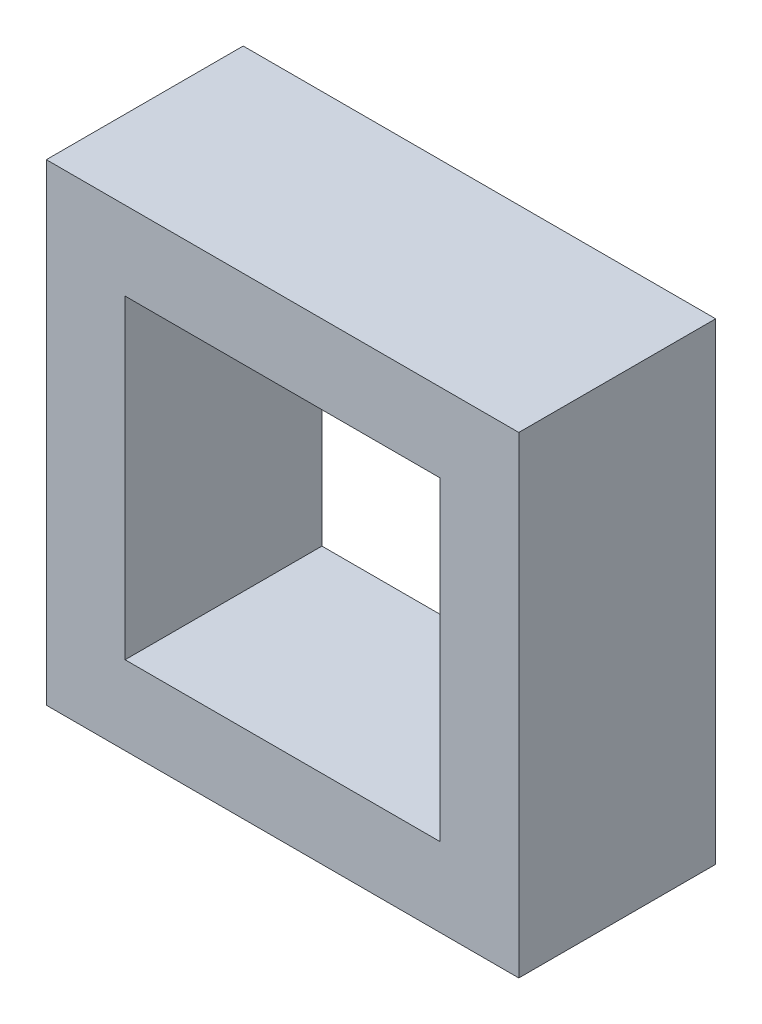
ISO-10303-21;
HEADER;
FILE_DESCRIPTION(('STEP AP214'),'2;1');
FILE_NAME('part.step','',(''),(''),'','','');
FILE_SCHEMA(('AUTOMOTIVE_DESIGN { 1 0 10303 214 1 1 1 1 }'));
ENDSEC;
DATA;
#1=APPLICATION_CONTEXT('core data for automotive mechanical design processes');
#2=APPLICATION_PROTOCOL_DEFINITION('international standard','automotive_design',2000,#1);
#3=PRODUCT_CONTEXT('',#1,'mechanical');
#4=PRODUCT('Part','Part','',(#3));
#5=PRODUCT_RELATED_PRODUCT_CATEGORY('part','',(#4));
#6=PRODUCT_DEFINITION_FORMATION('','',#4);
#7=PRODUCT_DEFINITION_CONTEXT('part definition',#1,'design');
#8=PRODUCT_DEFINITION('design','',#6,#7);
#9=PRODUCT_DEFINITION_SHAPE('','',#8);
#10=(LENGTH_UNIT() NAMED_UNIT(*) SI_UNIT(.MILLI.,.METRE.));
#11=(NAMED_UNIT(*) PLANE_ANGLE_UNIT() SI_UNIT($,.RADIAN.));
#12=(NAMED_UNIT(*) SI_UNIT($,.STERADIAN.) SOLID_ANGLE_UNIT());
#13=UNCERTAINTY_MEASURE_WITH_UNIT(LENGTH_MEASURE(1.E-05),#10,'distance_accuracy_value','');
#14=(GEOMETRIC_REPRESENTATION_CONTEXT(3) GLOBAL_UNCERTAINTY_ASSIGNED_CONTEXT((#13)) GLOBAL_UNIT_ASSIGNED_CONTEXT((#10,
#11,#12)) REPRESENTATION_CONTEXT('',''));
#15=CARTESIAN_POINT('',(0.,0.,0.));
#16=DIRECTION('',(0.,0.,1.));
#17=DIRECTION('',(1.,0.,0.));
#18=AXIS2_PLACEMENT_3D('',#15,#16,#17);
#19=CARTESIAN_POINT('',(0.,0.,5.));
#20=DIRECTION('',(0.,0.,1.));
#21=DIRECTION('',(1.,0.,0.));
#22=AXIS2_PLACEMENT_3D('',#19,#20,#21);
#23=PLANE('',#22);
#24=DIRECTION('',(0.,-1.,0.));
#25=VECTOR('',#24,1.);
#26=CARTESIAN_POINT('',(-12.,12.,5.));
#27=LINE('',#26,#25);
#28=CARTESIAN_POINT('',(-12.,12.,5.));
#29=VERTEX_POINT('',#28);
#30=CARTESIAN_POINT('',(-12.,-12.,5.));
#31=VERTEX_POINT('',#30);
#32=EDGE_CURVE('E134',#29,#31,#27,.T.);
#33=ORIENTED_EDGE('',*,*,#32,.T.);
#34=DIRECTION('',(1.,0.,0.));
#35=VECTOR('',#34,1.);
#36=CARTESIAN_POINT('',(-12.,-12.,5.));
#37=LINE('',#36,#35);
#38=CARTESIAN_POINT('',(12.,-12.,5.));
#39=VERTEX_POINT('',#38);
#40=EDGE_CURVE('E137',#31,#39,#37,.T.);
#41=ORIENTED_EDGE('',*,*,#40,.T.);
#42=DIRECTION('',(0.,1.,0.));
#43=VECTOR('',#42,1.);
#44=CARTESIAN_POINT('',(12.,12.,5.));
#45=LINE('',#44,#43);
#46=CARTESIAN_POINT('',(12.,12.,5.));
#47=VERTEX_POINT('',#46);
#48=EDGE_CURVE('E140',#39,#47,#45,.T.);
#49=ORIENTED_EDGE('',*,*,#48,.T.);
#50=DIRECTION('',(-1.,0.,0.));
#51=VECTOR('',#50,1.);
#52=CARTESIAN_POINT('',(-12.,12.,5.));
#53=LINE('',#52,#51);
#54=EDGE_CURVE('E142',#47,#29,#53,.T.);
#55=ORIENTED_EDGE('',*,*,#54,.T.);
#56=EDGE_LOOP('',(#33,#41,#49,#55));
#57=FACE_BOUND('',#56,.T.);
#58=DIRECTION('',(1.,0.,0.));
#59=VECTOR('',#58,1.);
#60=CARTESIAN_POINT('',(-8.,-8.,5.));
#61=LINE('',#60,#59);
#62=CARTESIAN_POINT('',(-8.,-8.,5.));
#63=VERTEX_POINT('',#62);
#64=CARTESIAN_POINT('',(8.,-8.,5.));
#65=VERTEX_POINT('',#64);
#66=EDGE_CURVE('E106',#63,#65,#61,.T.);
#67=ORIENTED_EDGE('',*,*,#66,.F.);
#68=DIRECTION('',(0.,-1.,0.));
#69=VECTOR('',#68,1.);
#70=CARTESIAN_POINT('',(-8.,8.,5.));
#71=LINE('',#70,#69);
#72=CARTESIAN_POINT('',(-8.,8.,5.));
#73=VERTEX_POINT('',#72);
#74=EDGE_CURVE('E98',#73,#63,#71,.T.);
#75=ORIENTED_EDGE('',*,*,#74,.F.);
#76=DIRECTION('',(-1.,0.,0.));
#77=VECTOR('',#76,1.);
#78=CARTESIAN_POINT('',(-8.,8.,5.));
#79=LINE('',#78,#77);
#80=CARTESIAN_POINT('',(8.,8.,5.));
#81=VERTEX_POINT('',#80);
#82=EDGE_CURVE('E120',#81,#73,#79,.T.);
#83=ORIENTED_EDGE('',*,*,#82,.F.);
#84=DIRECTION('',(0.,1.,0.));
#85=VECTOR('',#84,1.);
#86=CARTESIAN_POINT('',(8.,8.,5.));
#87=LINE('',#86,#85);
#88=EDGE_CURVE('E118',#65,#81,#87,.T.);
#89=ORIENTED_EDGE('',*,*,#88,.F.);
#90=EDGE_LOOP('',(#67,#75,#83,#89));
#91=FACE_BOUND('',#90,.T.);
#92=ADVANCED_FACE('F33',(#57,#91),#23,.T.);
#93=CARTESIAN_POINT('',(0.,0.,-5.));
#94=DIRECTION('',(0.,0.,1.));
#95=DIRECTION('',(1.,0.,0.));
#96=AXIS2_PLACEMENT_3D('',#93,#94,#95);
#97=PLANE('',#96);
#98=DIRECTION('',(0.,-1.,0.));
#99=VECTOR('',#98,1.);
#100=CARTESIAN_POINT('',(-12.,12.,-5.));
#101=LINE('',#100,#99);
#102=CARTESIAN_POINT('',(-12.,12.,-5.));
#103=VERTEX_POINT('',#102);
#104=CARTESIAN_POINT('',(-12.,-12.,-5.));
#105=VERTEX_POINT('',#104);
#106=EDGE_CURVE('E114',#103,#105,#101,.T.);
#107=ORIENTED_EDGE('',*,*,#106,.F.);
#108=DIRECTION('',(-1.,0.,0.));
#109=VECTOR('',#108,1.);
#110=CARTESIAN_POINT('',(-12.,12.,-5.));
#111=LINE('',#110,#109);
#112=CARTESIAN_POINT('',(12.,12.,-5.));
#113=VERTEX_POINT('',#112);
#114=EDGE_CURVE('E138',#113,#103,#111,.T.);
#115=ORIENTED_EDGE('',*,*,#114,.F.);
#116=DIRECTION('',(0.,1.,0.));
#117=VECTOR('',#116,1.);
#118=CARTESIAN_POINT('',(12.,12.,-5.));
#119=LINE('',#118,#117);
#120=CARTESIAN_POINT('',(12.,-12.,-5.));
#121=VERTEX_POINT('',#120);
#122=EDGE_CURVE('E149',#121,#113,#119,.T.);
#123=ORIENTED_EDGE('',*,*,#122,.F.);
#124=DIRECTION('',(1.,0.,0.));
#125=VECTOR('',#124,1.);
#126=CARTESIAN_POINT('',(-12.,-12.,-5.));
#127=LINE('',#126,#125);
#128=EDGE_CURVE('E147',#105,#121,#127,.T.);
#129=ORIENTED_EDGE('',*,*,#128,.F.);
#130=EDGE_LOOP('',(#107,#115,#123,#129));
#131=FACE_BOUND('',#130,.T.);
#132=DIRECTION('',(0.,-1.,0.));
#133=VECTOR('',#132,1.);
#134=CARTESIAN_POINT('',(-8.,8.,-5.));
#135=LINE('',#134,#133);
#136=CARTESIAN_POINT('',(-8.,8.,-5.));
#137=VERTEX_POINT('',#136);
#138=CARTESIAN_POINT('',(-8.,-8.,-5.));
#139=VERTEX_POINT('',#138);
#140=EDGE_CURVE('E56',#137,#139,#135,.T.);
#141=ORIENTED_EDGE('',*,*,#140,.T.);
#142=DIRECTION('',(1.,0.,0.));
#143=VECTOR('',#142,1.);
#144=CARTESIAN_POINT('',(-8.,-8.,-5.));
#145=LINE('',#144,#143);
#146=CARTESIAN_POINT('',(8.,-8.,-5.));
#147=VERTEX_POINT('',#146);
#148=EDGE_CURVE('E113',#139,#147,#145,.T.);
#149=ORIENTED_EDGE('',*,*,#148,.T.);
#150=DIRECTION('',(0.,1.,0.));
#151=VECTOR('',#150,1.);
#152=CARTESIAN_POINT('',(8.,8.,-5.));
#153=LINE('',#152,#151);
#154=CARTESIAN_POINT('',(8.,8.,-5.));
#155=VERTEX_POINT('',#154);
#156=EDGE_CURVE('E126',#147,#155,#153,.T.);
#157=ORIENTED_EDGE('',*,*,#156,.T.);
#158=DIRECTION('',(-1.,0.,0.));
#159=VECTOR('',#158,1.);
#160=CARTESIAN_POINT('',(-8.,8.,-5.));
#161=LINE('',#160,#159);
#162=EDGE_CURVE('E107',#155,#137,#161,.T.);
#163=ORIENTED_EDGE('',*,*,#162,.T.);
#164=EDGE_LOOP('',(#141,#149,#157,#163));
#165=FACE_BOUND('',#164,.T.);
#166=ADVANCED_FACE('F167',(#131,#165),#97,.F.);
#167=CARTESIAN_POINT('',(-12.,12.,5.));
#168=DIRECTION('',(1.,0.,0.));
#169=DIRECTION('',(0.,1.,0.));
#170=AXIS2_PLACEMENT_3D('',#167,#168,#169);
#171=PLANE('',#170);
#172=ORIENTED_EDGE('',*,*,#106,.T.);
#173=DIRECTION('',(0.,0.,-1.));
#174=VECTOR('',#173,1.);
#175=CARTESIAN_POINT('',(-12.,-12.,5.));
#176=LINE('',#175,#174);
#177=EDGE_CURVE('E11',#31,#105,#176,.T.);
#178=ORIENTED_EDGE('',*,*,#177,.F.);
#179=ORIENTED_EDGE('',*,*,#32,.F.);
#180=DIRECTION('',(0.,0.,-1.));
#181=VECTOR('',#180,1.);
#182=CARTESIAN_POINT('',(-12.,12.,5.));
#183=LINE('',#182,#181);
#184=EDGE_CURVE('E144',#29,#103,#183,.T.);
#185=ORIENTED_EDGE('',*,*,#184,.T.);
#186=EDGE_LOOP('',(#172,#178,#179,#185));
#187=FACE_BOUND('',#186,.T.);
#188=ADVANCED_FACE('F35',(#187),#171,.F.);
#189=CARTESIAN_POINT('',(-12.,-12.,5.));
#190=DIRECTION('',(0.,1.,0.));
#191=DIRECTION('',(0.,0.,1.));
#192=AXIS2_PLACEMENT_3D('',#189,#190,#191);
#193=PLANE('',#192);
#194=ORIENTED_EDGE('',*,*,#128,.T.);
#195=DIRECTION('',(0.,0.,-1.));
#196=VECTOR('',#195,1.);
#197=CARTESIAN_POINT('',(12.,-12.,5.));
#198=LINE('',#197,#196);
#199=EDGE_CURVE('E41',#39,#121,#198,.T.);
#200=ORIENTED_EDGE('',*,*,#199,.F.);
#201=ORIENTED_EDGE('',*,*,#40,.F.);
#202=ORIENTED_EDGE('',*,*,#177,.T.);
#203=EDGE_LOOP('',(#194,#200,#201,#202));
#204=FACE_BOUND('',#203,.T.);
#205=ADVANCED_FACE('F177',(#204),#193,.F.);
#206=CARTESIAN_POINT('',(12.,12.,5.));
#207=DIRECTION('',(-1.,0.,0.));
#208=DIRECTION('',(0.,-1.,0.));
#209=AXIS2_PLACEMENT_3D('',#206,#207,#208);
#210=PLANE('',#209);
#211=ORIENTED_EDGE('',*,*,#122,.T.);
#212=DIRECTION('',(0.,0.,-1.));
#213=VECTOR('',#212,1.);
#214=CARTESIAN_POINT('',(12.,12.,5.));
#215=LINE('',#214,#213);
#216=EDGE_CURVE('E154',#47,#113,#215,.T.);
#217=ORIENTED_EDGE('',*,*,#216,.F.);
#218=ORIENTED_EDGE('',*,*,#48,.F.);
#219=ORIENTED_EDGE('',*,*,#199,.T.);
#220=EDGE_LOOP('',(#211,#217,#218,#219));
#221=FACE_BOUND('',#220,.T.);
#222=ADVANCED_FACE('F161',(#221),#210,.F.);
#223=CARTESIAN_POINT('',(-12.,12.,5.));
#224=DIRECTION('',(0.,-1.,0.));
#225=DIRECTION('',(0.,0.,-1.));
#226=AXIS2_PLACEMENT_3D('',#223,#224,#225);
#227=PLANE('',#226);
#228=ORIENTED_EDGE('',*,*,#114,.T.);
#229=ORIENTED_EDGE('',*,*,#184,.F.);
#230=ORIENTED_EDGE('',*,*,#54,.F.);
#231=ORIENTED_EDGE('',*,*,#216,.T.);
#232=EDGE_LOOP('',(#228,#229,#230,#231));
#233=FACE_BOUND('',#232,.T.);
#234=ADVANCED_FACE('F171',(#233),#227,.F.);
#235=CARTESIAN_POINT('',(-8.,8.,5.));
#236=DIRECTION('',(1.,0.,0.));
#237=DIRECTION('',(0.,1.,0.));
#238=AXIS2_PLACEMENT_3D('',#235,#236,#237);
#239=PLANE('',#238);
#240=ORIENTED_EDGE('',*,*,#140,.F.);
#241=DIRECTION('',(0.,0.,-1.));
#242=VECTOR('',#241,1.);
#243=CARTESIAN_POINT('',(-8.,8.,5.));
#244=LINE('',#243,#242);
#245=EDGE_CURVE('E102',#73,#137,#244,.T.);
#246=ORIENTED_EDGE('',*,*,#245,.F.);
#247=ORIENTED_EDGE('',*,*,#74,.T.);
#248=DIRECTION('',(0.,0.,-1.));
#249=VECTOR('',#248,1.);
#250=CARTESIAN_POINT('',(-8.,-8.,5.));
#251=LINE('',#250,#249);
#252=EDGE_CURVE('E101',#63,#139,#251,.T.);
#253=ORIENTED_EDGE('',*,*,#252,.T.);
#254=EDGE_LOOP('',(#240,#246,#247,#253));
#255=FACE_BOUND('',#254,.T.);
#256=ADVANCED_FACE('F100',(#255),#239,.T.);
#257=CARTESIAN_POINT('',(-8.,-8.,5.));
#258=DIRECTION('',(0.,1.,0.));
#259=DIRECTION('',(-1.,0.,0.));
#260=AXIS2_PLACEMENT_3D('',#257,#258,#259);
#261=PLANE('',#260);
#262=ORIENTED_EDGE('',*,*,#148,.F.);
#263=ORIENTED_EDGE('',*,*,#252,.F.);
#264=ORIENTED_EDGE('',*,*,#66,.T.);
#265=DIRECTION('',(0.,0.,-1.));
#266=VECTOR('',#265,1.);
#267=CARTESIAN_POINT('',(8.,-8.,5.));
#268=LINE('',#267,#266);
#269=EDGE_CURVE('E115',#65,#147,#268,.T.);
#270=ORIENTED_EDGE('',*,*,#269,.T.);
#271=EDGE_LOOP('',(#262,#263,#264,#270));
#272=FACE_BOUND('',#271,.T.);
#273=ADVANCED_FACE('F110',(#272),#261,.T.);
#274=CARTESIAN_POINT('',(8.,8.,5.));
#275=DIRECTION('',(-1.,0.,0.));
#276=DIRECTION('',(0.,-1.,0.));
#277=AXIS2_PLACEMENT_3D('',#274,#275,#276);
#278=PLANE('',#277);
#279=ORIENTED_EDGE('',*,*,#156,.F.);
#280=ORIENTED_EDGE('',*,*,#269,.F.);
#281=ORIENTED_EDGE('',*,*,#88,.T.);
#282=DIRECTION('',(0.,0.,-1.));
#283=VECTOR('',#282,1.);
#284=CARTESIAN_POINT('',(8.,8.,5.));
#285=LINE('',#284,#283);
#286=EDGE_CURVE('E48',#81,#155,#285,.T.);
#287=ORIENTED_EDGE('',*,*,#286,.T.);
#288=EDGE_LOOP('',(#279,#280,#281,#287));
#289=FACE_BOUND('',#288,.T.);
#290=ADVANCED_FACE('F200',(#289),#278,.T.);
#291=CARTESIAN_POINT('',(-8.,8.,5.));
#292=DIRECTION('',(0.,-1.,0.));
#293=DIRECTION('',(0.,0.,-1.));
#294=AXIS2_PLACEMENT_3D('',#291,#292,#293);
#295=PLANE('',#294);
#296=ORIENTED_EDGE('',*,*,#162,.F.);
#297=ORIENTED_EDGE('',*,*,#286,.F.);
#298=ORIENTED_EDGE('',*,*,#82,.T.);
#299=ORIENTED_EDGE('',*,*,#245,.T.);
#300=EDGE_LOOP('',(#296,#297,#298,#299));
#301=FACE_BOUND('',#300,.T.);
#302=ADVANCED_FACE('F204',(#301),#295,.T.);
#303=CLOSED_SHELL('',(#92,#166,#188,#205,#222,#234,#256,#273,#290,#302));
#304=MANIFOLD_SOLID_BREP('B2',#303);
#305=ADVANCED_BREP_SHAPE_REPRESENTATION('',(#18,#304),#14);
#306=SHAPE_DEFINITION_REPRESENTATION(#9,#305);
ENDSEC;
END-ISO-10303-21;
